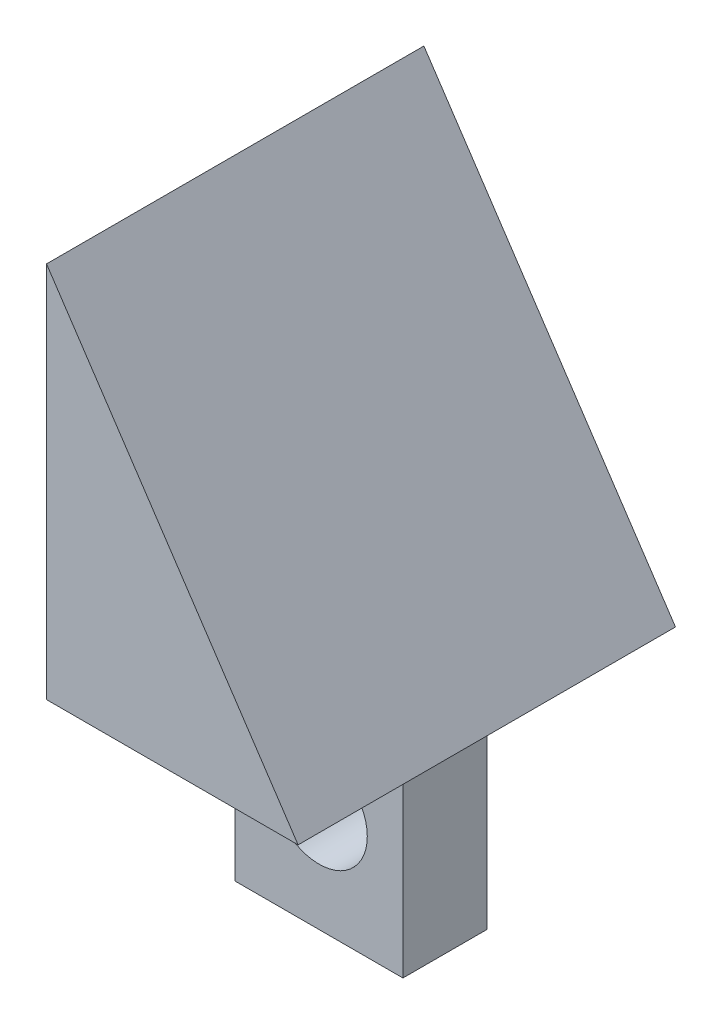
ISO-10303-21;
HEADER;
FILE_DESCRIPTION(('STEP AP214'),'2;1');
FILE_NAME('part.step','',(''),(''),'','','');
FILE_SCHEMA(('AUTOMOTIVE_DESIGN { 1 0 10303 214 1 1 1 1 }'));
ENDSEC;
DATA;
#1=APPLICATION_CONTEXT('core data for automotive mechanical design processes');
#2=APPLICATION_PROTOCOL_DEFINITION('international standard','automotive_design',2000,#1);
#3=PRODUCT_CONTEXT('',#1,'mechanical');
#4=PRODUCT('Part','Part','',(#3));
#5=PRODUCT_RELATED_PRODUCT_CATEGORY('part','',(#4));
#6=PRODUCT_DEFINITION_FORMATION('','',#4);
#7=PRODUCT_DEFINITION_CONTEXT('part definition',#1,'design');
#8=PRODUCT_DEFINITION('design','',#6,#7);
#9=PRODUCT_DEFINITION_SHAPE('','',#8);
#10=(LENGTH_UNIT() NAMED_UNIT(*) SI_UNIT(.MILLI.,.METRE.));
#11=(NAMED_UNIT(*) PLANE_ANGLE_UNIT() SI_UNIT($,.RADIAN.));
#12=(NAMED_UNIT(*) SI_UNIT($,.STERADIAN.) SOLID_ANGLE_UNIT());
#13=UNCERTAINTY_MEASURE_WITH_UNIT(LENGTH_MEASURE(1.E-05),#10,'distance_accuracy_value','');
#14=(GEOMETRIC_REPRESENTATION_CONTEXT(3) GLOBAL_UNCERTAINTY_ASSIGNED_CONTEXT((#13)) GLOBAL_UNIT_ASSIGNED_CONTEXT((#10,
#11,#12)) REPRESENTATION_CONTEXT('',''));
#15=CARTESIAN_POINT('',(0.,0.,0.));
#16=DIRECTION('',(0.,0.,1.));
#17=DIRECTION('',(1.,0.,0.));
#18=AXIS2_PLACEMENT_3D('',#15,#16,#17);
#19=CARTESIAN_POINT('',(12.,0.,18.));
#20=DIRECTION('',(0.,1.,0.));
#21=DIRECTION('',(-1.,0.,0.));
#22=AXIS2_PLACEMENT_3D('',#19,#20,#21);
#23=PLANE('',#22);
#24=DIRECTION('',(-1.,0.,0.));
#25=VECTOR('',#24,1.);
#26=CARTESIAN_POINT('',(2.,0.,11.));
#27=LINE('',#26,#25);
#28=CARTESIAN_POINT('',(10.,0.,11.));
#29=VERTEX_POINT('',#28);
#30=CARTESIAN_POINT('',(2.,0.,11.));
#31=VERTEX_POINT('',#30);
#32=EDGE_CURVE('E128',#29,#31,#27,.T.);
#33=ORIENTED_EDGE('',*,*,#32,.F.);
#34=DIRECTION('',(0.,0.,-1.));
#35=VECTOR('',#34,1.);
#36=CARTESIAN_POINT('',(10.,0.,11.));
#37=LINE('',#36,#35);
#38=CARTESIAN_POINT('',(10.,0.,7.));
#39=VERTEX_POINT('',#38);
#40=EDGE_CURVE('E47',#29,#39,#37,.T.);
#41=ORIENTED_EDGE('',*,*,#40,.T.);
#42=DIRECTION('',(-1.,0.,0.));
#43=VECTOR('',#42,1.);
#44=CARTESIAN_POINT('',(2.,0.,7.));
#45=LINE('',#44,#43);
#46=CARTESIAN_POINT('',(2.,0.,7.));
#47=VERTEX_POINT('',#46);
#48=EDGE_CURVE('E52',#39,#47,#45,.T.);
#49=ORIENTED_EDGE('',*,*,#48,.T.);
#50=DIRECTION('',(0.,0.,-1.));
#51=VECTOR('',#50,1.);
#52=CARTESIAN_POINT('',(2.,0.,11.));
#53=LINE('',#52,#51);
#54=EDGE_CURVE('E111',#31,#47,#53,.T.);
#55=ORIENTED_EDGE('',*,*,#54,.F.);
#56=EDGE_LOOP('',(#33,#41,#49,#55));
#57=FACE_BOUND('',#56,.T.);
#58=DIRECTION('',(1.,0.,0.));
#59=VECTOR('',#58,1.);
#60=CARTESIAN_POINT('',(12.,0.,0.));
#61=LINE('',#60,#59);
#62=CARTESIAN_POINT('',(0.,0.,0.));
#63=VERTEX_POINT('',#62);
#64=CARTESIAN_POINT('',(12.,0.,0.));
#65=VERTEX_POINT('',#64);
#66=EDGE_CURVE('E100',#63,#65,#61,.T.);
#67=ORIENTED_EDGE('',*,*,#66,.T.);
#68=DIRECTION('',(0.,0.,-1.));
#69=VECTOR('',#68,1.);
#70=CARTESIAN_POINT('',(12.,0.,18.));
#71=LINE('',#70,#69);
#72=CARTESIAN_POINT('',(12.,0.,18.));
#73=VERTEX_POINT('',#72);
#74=EDGE_CURVE('E11',#73,#65,#71,.T.);
#75=ORIENTED_EDGE('',*,*,#74,.F.);
#76=DIRECTION('',(1.,0.,0.));
#77=VECTOR('',#76,1.);
#78=CARTESIAN_POINT('',(12.,0.,18.));
#79=LINE('',#78,#77);
#80=CARTESIAN_POINT('',(0.,0.,18.));
#81=VERTEX_POINT('',#80);
#82=EDGE_CURVE('E134',#81,#73,#79,.T.);
#83=ORIENTED_EDGE('',*,*,#82,.F.);
#84=DIRECTION('',(0.,0.,-1.));
#85=VECTOR('',#84,1.);
#86=CARTESIAN_POINT('',(0.,0.,18.));
#87=LINE('',#86,#85);
#88=EDGE_CURVE('E142',#81,#63,#87,.T.);
#89=ORIENTED_EDGE('',*,*,#88,.T.);
#90=EDGE_LOOP('',(#67,#75,#83,#89));
#91=FACE_BOUND('',#90,.T.);
#92=ADVANCED_FACE('F33',(#57,#91),#23,.F.);
#93=CARTESIAN_POINT('',(0.,18.,18.));
#94=DIRECTION('',(-0.832050294337843,-0.554700196225229,0.));
#95=DIRECTION('',(0.554700196225229,-0.832050294337844,0.));
#96=AXIS2_PLACEMENT_3D('',#93,#94,#95);
#97=PLANE('',#96);
#98=DIRECTION('',(-0.554700196225229,0.832050294337844,0.));
#99=VECTOR('',#98,1.);
#100=CARTESIAN_POINT('',(0.,18.,0.));
#101=LINE('',#100,#99);
#102=CARTESIAN_POINT('',(0.,18.,0.));
#103=VERTEX_POINT('',#102);
#104=EDGE_CURVE('E145',#65,#103,#101,.T.);
#105=ORIENTED_EDGE('',*,*,#104,.T.);
#106=DIRECTION('',(0.,0.,-1.));
#107=VECTOR('',#106,1.);
#108=CARTESIAN_POINT('',(0.,18.,18.));
#109=LINE('',#108,#107);
#110=CARTESIAN_POINT('',(0.,18.,18.));
#111=VERTEX_POINT('',#110);
#112=EDGE_CURVE('E40',#111,#103,#109,.T.);
#113=ORIENTED_EDGE('',*,*,#112,.F.);
#114=DIRECTION('',(-0.554700196225229,0.832050294337844,0.));
#115=VECTOR('',#114,1.);
#116=CARTESIAN_POINT('',(0.,18.,18.));
#117=LINE('',#116,#115);
#118=EDGE_CURVE('E137',#73,#111,#117,.T.);
#119=ORIENTED_EDGE('',*,*,#118,.F.);
#120=ORIENTED_EDGE('',*,*,#74,.T.);
#121=EDGE_LOOP('',(#105,#113,#119,#120));
#122=FACE_BOUND('',#121,.T.);
#123=ADVANCED_FACE('F165',(#122),#97,.F.);
#124=CARTESIAN_POINT('',(0.,0.,18.));
#125=DIRECTION('',(1.,0.,0.));
#126=DIRECTION('',(0.,0.,-1.));
#127=AXIS2_PLACEMENT_3D('',#124,#125,#126);
#128=PLANE('',#127);
#129=DIRECTION('',(0.,-1.,0.));
#130=VECTOR('',#129,1.);
#131=CARTESIAN_POINT('',(0.,0.,0.));
#132=LINE('',#131,#130);
#133=EDGE_CURVE('E138',#103,#63,#132,.T.);
#134=ORIENTED_EDGE('',*,*,#133,.T.);
#135=ORIENTED_EDGE('',*,*,#88,.F.);
#136=DIRECTION('',(0.,-1.,0.));
#137=VECTOR('',#136,1.);
#138=CARTESIAN_POINT('',(0.,0.,18.));
#139=LINE('',#138,#137);
#140=EDGE_CURVE('E140',#111,#81,#139,.T.);
#141=ORIENTED_EDGE('',*,*,#140,.F.);
#142=ORIENTED_EDGE('',*,*,#112,.T.);
#143=EDGE_LOOP('',(#134,#135,#141,#142));
#144=FACE_BOUND('',#143,.T.);
#145=ADVANCED_FACE('F154',(#144),#128,.F.);
#146=CARTESIAN_POINT('',(0.,0.,18.));
#147=DIRECTION('',(0.,0.,-1.));
#148=DIRECTION('',(-1.,0.,0.));
#149=AXIS2_PLACEMENT_3D('',#146,#147,#148);
#150=PLANE('',#149);
#151=ORIENTED_EDGE('',*,*,#82,.T.);
#152=ORIENTED_EDGE('',*,*,#118,.T.);
#153=ORIENTED_EDGE('',*,*,#140,.T.);
#154=EDGE_LOOP('',(#151,#152,#153));
#155=FACE_BOUND('',#154,.T.);
#156=ADVANCED_FACE('F164',(#155),#150,.F.);
#157=CARTESIAN_POINT('',(0.,0.,0.));
#158=DIRECTION('',(0.,0.,-1.));
#159=DIRECTION('',(-1.,0.,0.));
#160=AXIS2_PLACEMENT_3D('',#157,#158,#159);
#161=PLANE('',#160);
#162=ORIENTED_EDGE('',*,*,#66,.F.);
#163=ORIENTED_EDGE('',*,*,#133,.F.);
#164=ORIENTED_EDGE('',*,*,#104,.F.);
#165=EDGE_LOOP('',(#162,#163,#164));
#166=FACE_BOUND('',#165,.T.);
#167=ADVANCED_FACE('F159',(#166),#161,.T.);
#168=CARTESIAN_POINT('',(0.,0.,11.));
#169=DIRECTION('',(0.,0.,1.));
#170=DIRECTION('',(1.,0.,0.));
#171=AXIS2_PLACEMENT_3D('',#168,#169,#170);
#172=PLANE('',#171);
#173=DIRECTION('',(0.,-1.,0.));
#174=VECTOR('',#173,1.);
#175=CARTESIAN_POINT('',(2.,0.,11.));
#176=LINE('',#175,#174);
#177=CARTESIAN_POINT('',(2.,-10.,11.));
#178=VERTEX_POINT('',#177);
#179=EDGE_CURVE('E122',#31,#178,#176,.T.);
#180=ORIENTED_EDGE('',*,*,#179,.T.);
#181=DIRECTION('',(1.,0.,0.));
#182=VECTOR('',#181,1.);
#183=CARTESIAN_POINT('',(2.,-10.,11.));
#184=LINE('',#183,#182);
#185=CARTESIAN_POINT('',(10.,-10.,11.));
#186=VERTEX_POINT('',#185);
#187=EDGE_CURVE('E95',#178,#186,#184,.T.);
#188=ORIENTED_EDGE('',*,*,#187,.T.);
#189=DIRECTION('',(0.,1.,0.));
#190=VECTOR('',#189,1.);
#191=CARTESIAN_POINT('',(10.,0.,11.));
#192=LINE('',#191,#190);
#193=EDGE_CURVE('E125',#186,#29,#192,.T.);
#194=ORIENTED_EDGE('',*,*,#193,.T.);
#195=ORIENTED_EDGE('',*,*,#32,.T.);
#196=EDGE_LOOP('',(#180,#188,#194,#195));
#197=FACE_BOUND('',#196,.T.);
#198=CARTESIAN_POINT('',(6.,-5.,11.));
#199=DIRECTION('',(0.,0.,1.));
#200=DIRECTION('',(1.,0.,0.));
#201=AXIS2_PLACEMENT_3D('',#198,#199,#200);
#202=CIRCLE('',#201,2.3);
#203=CARTESIAN_POINT('',(8.3,-5.,11.));
#204=VERTEX_POINT('',#203);
#205=EDGE_CURVE('E119',#204,#204,#202,.T.);
#206=ORIENTED_EDGE('',*,*,#205,.F.);
#207=EDGE_LOOP('',(#206));
#208=FACE_BOUND('',#207,.T.);
#209=ADVANCED_FACE('F175',(#197,#208),#172,.T.);
#210=CARTESIAN_POINT('',(2.,0.,11.));
#211=DIRECTION('',(1.,0.,0.));
#212=DIRECTION('',(0.,0.,-1.));
#213=AXIS2_PLACEMENT_3D('',#210,#211,#212);
#214=PLANE('',#213);
#215=ORIENTED_EDGE('',*,*,#54,.T.);
#216=DIRECTION('',(0.,-1.,0.));
#217=VECTOR('',#216,1.);
#218=CARTESIAN_POINT('',(2.,0.,7.));
#219=LINE('',#218,#217);
#220=CARTESIAN_POINT('',(2.,-10.,7.));
#221=VERTEX_POINT('',#220);
#222=EDGE_CURVE('E107',#47,#221,#219,.T.);
#223=ORIENTED_EDGE('',*,*,#222,.T.);
#224=DIRECTION('',(0.,0.,-1.));
#225=VECTOR('',#224,1.);
#226=CARTESIAN_POINT('',(2.,-10.,11.));
#227=LINE('',#226,#225);
#228=EDGE_CURVE('E90',#178,#221,#227,.T.);
#229=ORIENTED_EDGE('',*,*,#228,.F.);
#230=ORIENTED_EDGE('',*,*,#179,.F.);
#231=EDGE_LOOP('',(#215,#223,#229,#230));
#232=FACE_BOUND('',#231,.T.);
#233=ADVANCED_FACE('F110',(#232),#214,.F.);
#234=CARTESIAN_POINT('',(2.,-10.,11.));
#235=DIRECTION('',(0.,1.,0.));
#236=DIRECTION('',(0.,0.,1.));
#237=AXIS2_PLACEMENT_3D('',#234,#235,#236);
#238=PLANE('',#237);
#239=ORIENTED_EDGE('',*,*,#228,.T.);
#240=DIRECTION('',(1.,0.,0.));
#241=VECTOR('',#240,1.);
#242=CARTESIAN_POINT('',(2.,-10.,7.));
#243=LINE('',#242,#241);
#244=CARTESIAN_POINT('',(10.,-10.,7.));
#245=VERTEX_POINT('',#244);
#246=EDGE_CURVE('E94',#221,#245,#243,.T.);
#247=ORIENTED_EDGE('',*,*,#246,.T.);
#248=DIRECTION('',(0.,0.,-1.));
#249=VECTOR('',#248,1.);
#250=CARTESIAN_POINT('',(10.,-10.,11.));
#251=LINE('',#250,#249);
#252=EDGE_CURVE('E101',#186,#245,#251,.T.);
#253=ORIENTED_EDGE('',*,*,#252,.F.);
#254=ORIENTED_EDGE('',*,*,#187,.F.);
#255=EDGE_LOOP('',(#239,#247,#253,#254));
#256=FACE_BOUND('',#255,.T.);
#257=ADVANCED_FACE('F92',(#256),#238,.F.);
#258=CARTESIAN_POINT('',(10.,0.,11.));
#259=DIRECTION('',(-1.,0.,0.));
#260=DIRECTION('',(0.,-1.,0.));
#261=AXIS2_PLACEMENT_3D('',#258,#259,#260);
#262=PLANE('',#261);
#263=ORIENTED_EDGE('',*,*,#252,.T.);
#264=DIRECTION('',(0.,1.,0.));
#265=VECTOR('',#264,1.);
#266=CARTESIAN_POINT('',(10.,0.,7.));
#267=LINE('',#266,#265);
#268=EDGE_CURVE('E108',#245,#39,#267,.T.);
#269=ORIENTED_EDGE('',*,*,#268,.T.);
#270=ORIENTED_EDGE('',*,*,#40,.F.);
#271=ORIENTED_EDGE('',*,*,#193,.F.);
#272=EDGE_LOOP('',(#263,#269,#270,#271));
#273=FACE_BOUND('',#272,.T.);
#274=ADVANCED_FACE('F182',(#273),#262,.F.);
#275=CARTESIAN_POINT('',(6.,-5.,11.));
#276=DIRECTION('',(0.,0.,-1.));
#277=DIRECTION('',(-1.,0.,0.));
#278=AXIS2_PLACEMENT_3D('',#275,#276,#277);
#279=CYLINDRICAL_SURFACE('',#278,2.3);
#280=ORIENTED_EDGE('',*,*,#205,.T.);
#281=EDGE_LOOP('',(#280));
#282=FACE_BOUND('',#281,.T.);
#283=CARTESIAN_POINT('',(6.,-5.,7.));
#284=DIRECTION('',(0.,0.,1.));
#285=DIRECTION('',(1.,0.,0.));
#286=AXIS2_PLACEMENT_3D('',#283,#284,#285);
#287=CIRCLE('',#286,2.3);
#288=CARTESIAN_POINT('',(8.3,-5.,7.));
#289=VERTEX_POINT('',#288);
#290=EDGE_CURVE('E112',#289,#289,#287,.T.);
#291=ORIENTED_EDGE('',*,*,#290,.F.);
#292=EDGE_LOOP('',(#291));
#293=FACE_BOUND('',#292,.T.);
#294=ADVANCED_FACE('F185',(#282,#293),#279,.F.);
#295=CARTESIAN_POINT('',(0.,0.,7.));
#296=DIRECTION('',(0.,0.,1.));
#297=DIRECTION('',(1.,0.,0.));
#298=AXIS2_PLACEMENT_3D('',#295,#296,#297);
#299=PLANE('',#298);
#300=ORIENTED_EDGE('',*,*,#290,.T.);
#301=EDGE_LOOP('',(#300));
#302=FACE_BOUND('',#301,.T.);
#303=ORIENTED_EDGE('',*,*,#222,.F.);
#304=ORIENTED_EDGE('',*,*,#48,.F.);
#305=ORIENTED_EDGE('',*,*,#268,.F.);
#306=ORIENTED_EDGE('',*,*,#246,.F.);
#307=EDGE_LOOP('',(#303,#304,#305,#306));
#308=FACE_BOUND('',#307,.T.);
#309=ADVANCED_FACE('F106',(#302,#308),#299,.F.);
#310=CLOSED_SHELL('',(#92,#123,#145,#156,#167,#209,#233,#257,#274,#294,#309));
#311=MANIFOLD_SOLID_BREP('B2',#310);
#312=ADVANCED_BREP_SHAPE_REPRESENTATION('',(#18,#311),#14);
#313=SHAPE_DEFINITION_REPRESENTATION(#9,#312);
ENDSEC;
END-ISO-10303-21;
